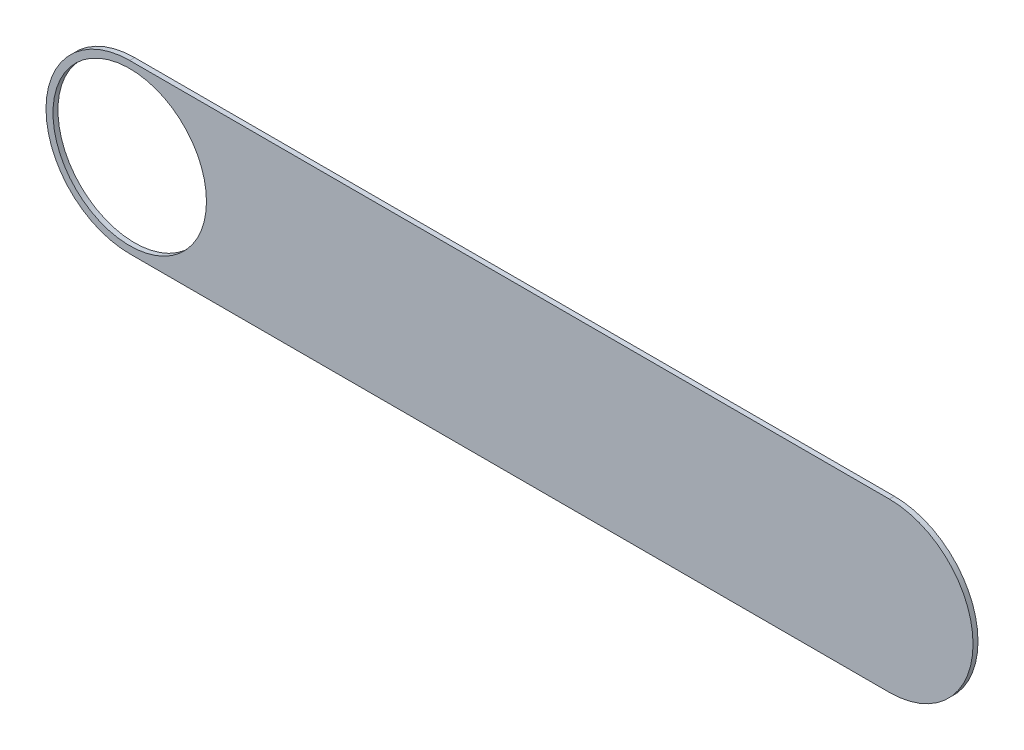
ISO-10303-21;
HEADER;
FILE_DESCRIPTION(('STEP AP214'),'2;1');
FILE_NAME('part.step','',(''),(''),'','','');
FILE_SCHEMA(('AUTOMOTIVE_DESIGN { 1 0 10303 214 1 1 1 1 }'));
ENDSEC;
DATA;
#1=APPLICATION_CONTEXT('core data for automotive mechanical design processes');
#2=APPLICATION_PROTOCOL_DEFINITION('international standard','automotive_design',2000,#1);
#3=PRODUCT_CONTEXT('',#1,'mechanical');
#4=PRODUCT('Part','Part','',(#3));
#5=PRODUCT_RELATED_PRODUCT_CATEGORY('part','',(#4));
#6=PRODUCT_DEFINITION_FORMATION('','',#4);
#7=PRODUCT_DEFINITION_CONTEXT('part definition',#1,'design');
#8=PRODUCT_DEFINITION('design','',#6,#7);
#9=PRODUCT_DEFINITION_SHAPE('','',#8);
#10=(LENGTH_UNIT() NAMED_UNIT(*) SI_UNIT(.MILLI.,.METRE.));
#11=(NAMED_UNIT(*) PLANE_ANGLE_UNIT() SI_UNIT($,.RADIAN.));
#12=(NAMED_UNIT(*) SI_UNIT($,.STERADIAN.) SOLID_ANGLE_UNIT());
#13=UNCERTAINTY_MEASURE_WITH_UNIT(LENGTH_MEASURE(1.E-05),#10,'distance_accuracy_value','');
#14=(GEOMETRIC_REPRESENTATION_CONTEXT(3) GLOBAL_UNCERTAINTY_ASSIGNED_CONTEXT((#13)) GLOBAL_UNIT_ASSIGNED_CONTEXT((#10,
#11,#12)) REPRESENTATION_CONTEXT('',''));
#15=CARTESIAN_POINT('',(0.,0.,0.));
#16=DIRECTION('',(0.,0.,1.));
#17=DIRECTION('',(1.,0.,0.));
#18=AXIS2_PLACEMENT_3D('',#15,#16,#17);
#19=CARTESIAN_POINT('',(85.742018,56.687466,0.));
#20=DIRECTION('',(0.,1.,0.));
#21=DIRECTION('',(1.,0.,0.));
#22=AXIS2_PLACEMENT_3D('',#19,#20,#21);
#23=PLANE('',#22);
#24=DIRECTION('',(1.,0.,0.));
#25=VECTOR('',#24,1.);
#26=CARTESIAN_POINT('',(85.742018,56.687466,0.03556));
#27=LINE('',#26,#25);
#28=CARTESIAN_POINT('',(85.742018,56.687466,0.03556));
#29=VERTEX_POINT('',#28);
#30=CARTESIAN_POINT('',(91.186,56.687466,0.03556));
#31=VERTEX_POINT('',#30);
#32=EDGE_CURVE('E11',#29,#31,#27,.T.);
#33=ORIENTED_EDGE('',*,*,#32,.F.);
#34=DIRECTION('',(0.,0.,1.));
#35=VECTOR('',#34,1.);
#36=CARTESIAN_POINT('',(85.742018,56.687466,0.));
#37=LINE('',#36,#35);
#38=CARTESIAN_POINT('',(85.742018,56.687466,0.));
#39=VERTEX_POINT('',#38);
#40=EDGE_CURVE('E24',#39,#29,#37,.T.);
#41=ORIENTED_EDGE('',*,*,#40,.F.);
#42=DIRECTION('',(1.,0.,0.));
#43=VECTOR('',#42,1.);
#44=CARTESIAN_POINT('',(85.742018,56.687466,0.));
#45=LINE('',#44,#43);
#46=CARTESIAN_POINT('',(91.186,56.687466,0.));
#47=VERTEX_POINT('',#46);
#48=EDGE_CURVE('E96',#39,#47,#45,.T.);
#49=ORIENTED_EDGE('',*,*,#48,.T.);
#50=DIRECTION('',(0.,0.,1.));
#51=VECTOR('',#50,1.);
#52=CARTESIAN_POINT('',(91.186,56.687466,0.));
#53=LINE('',#52,#51);
#54=EDGE_CURVE('E37',#47,#31,#53,.T.);
#55=ORIENTED_EDGE('',*,*,#54,.T.);
#56=EDGE_LOOP('',(#33,#41,#49,#55));
#57=FACE_BOUND('',#56,.T.);
#58=ADVANCED_FACE('F17',(#57),#23,.F.);
#59=CARTESIAN_POINT('',(85.742018,57.2874648,0.));
#60=DIRECTION('',(0.,0.,-1.));
#61=DIRECTION('',(0.,1.,0.));
#62=AXIS2_PLACEMENT_3D('',#59,#60,#61);
#63=CYLINDRICAL_SURFACE('',#62,0.599998799999997);
#64=CARTESIAN_POINT('',(85.742018,57.2874648,0.03556));
#65=DIRECTION('',(0.,0.,1.));
#66=DIRECTION('',(0.,1.,0.));
#67=AXIS2_PLACEMENT_3D('',#64,#65,#66);
#68=CIRCLE('',#67,0.599998799999997);
#69=CARTESIAN_POINT('',(85.742018,57.8874636,0.03556));
#70=VERTEX_POINT('',#69);
#71=EDGE_CURVE('E92',#70,#29,#68,.T.);
#72=ORIENTED_EDGE('',*,*,#71,.F.);
#73=DIRECTION('',(0.,0.,1.));
#74=VECTOR('',#73,1.);
#75=CARTESIAN_POINT('',(85.742018,57.8874636,0.));
#76=LINE('',#75,#74);
#77=CARTESIAN_POINT('',(85.742018,57.8874636,0.));
#78=VERTEX_POINT('',#77);
#79=EDGE_CURVE('E90',#78,#70,#76,.T.);
#80=ORIENTED_EDGE('',*,*,#79,.F.);
#81=CARTESIAN_POINT('',(85.742018,57.2874648,0.));
#82=DIRECTION('',(0.,0.,1.));
#83=DIRECTION('',(0.,1.,0.));
#84=AXIS2_PLACEMENT_3D('',#81,#82,#83);
#85=CIRCLE('',#84,0.599998799999997);
#86=EDGE_CURVE('E88',#78,#39,#85,.T.);
#87=ORIENTED_EDGE('',*,*,#86,.T.);
#88=ORIENTED_EDGE('',*,*,#40,.T.);
#89=EDGE_LOOP('',(#72,#80,#87,#88));
#90=FACE_BOUND('',#89,.T.);
#91=ADVANCED_FACE('F111',(#90),#63,.T.);
#92=CARTESIAN_POINT('',(91.186,57.2874648,0.));
#93=DIRECTION('',(0.,0.,-1.));
#94=DIRECTION('',(0.,-1.,0.));
#95=AXIS2_PLACEMENT_3D('',#92,#93,#94);
#96=CYLINDRICAL_SURFACE('',#95,0.599998800000002);
#97=CARTESIAN_POINT('',(91.186,57.2874648,0.03556));
#98=DIRECTION('',(0.,0.,1.));
#99=DIRECTION('',(0.,-1.,0.));
#100=AXIS2_PLACEMENT_3D('',#97,#98,#99);
#101=CIRCLE('',#100,0.599998800000002);
#102=CARTESIAN_POINT('',(91.186,57.8874636,0.03556));
#103=VERTEX_POINT('',#102);
#104=EDGE_CURVE('E85',#31,#103,#101,.T.);
#105=ORIENTED_EDGE('',*,*,#104,.F.);
#106=ORIENTED_EDGE('',*,*,#54,.F.);
#107=CARTESIAN_POINT('',(91.186,57.2874648,0.));
#108=DIRECTION('',(0.,0.,1.));
#109=DIRECTION('',(0.,-1.,0.));
#110=AXIS2_PLACEMENT_3D('',#107,#108,#109);
#111=CIRCLE('',#110,0.599998800000002);
#112=CARTESIAN_POINT('',(91.186,57.8874636,0.));
#113=VERTEX_POINT('',#112);
#114=EDGE_CURVE('E82',#47,#113,#111,.T.);
#115=ORIENTED_EDGE('',*,*,#114,.T.);
#116=DIRECTION('',(0.,0.,1.));
#117=VECTOR('',#116,1.);
#118=CARTESIAN_POINT('',(91.186,57.8874636,0.));
#119=LINE('',#118,#117);
#120=EDGE_CURVE('E80',#113,#103,#119,.T.);
#121=ORIENTED_EDGE('',*,*,#120,.T.);
#122=EDGE_LOOP('',(#105,#106,#115,#121));
#123=FACE_BOUND('',#122,.T.);
#124=ADVANCED_FACE('F104',(#123),#96,.T.);
#125=CARTESIAN_POINT('',(91.186,57.8874636,0.));
#126=DIRECTION('',(0.,-1.,0.));
#127=DIRECTION('',(-1.,0.,0.));
#128=AXIS2_PLACEMENT_3D('',#125,#126,#127);
#129=PLANE('',#128);
#130=DIRECTION('',(-1.,0.,0.));
#131=VECTOR('',#130,1.);
#132=CARTESIAN_POINT('',(91.186,57.8874636,0.03556));
#133=LINE('',#132,#131);
#134=EDGE_CURVE('E77',#103,#70,#133,.T.);
#135=ORIENTED_EDGE('',*,*,#134,.F.);
#136=ORIENTED_EDGE('',*,*,#120,.F.);
#137=DIRECTION('',(-1.,0.,0.));
#138=VECTOR('',#137,1.);
#139=CARTESIAN_POINT('',(91.186,57.8874636,0.));
#140=LINE('',#139,#138);
#141=EDGE_CURVE('E68',#113,#78,#140,.T.);
#142=ORIENTED_EDGE('',*,*,#141,.T.);
#143=ORIENTED_EDGE('',*,*,#79,.T.);
#144=EDGE_LOOP('',(#135,#136,#142,#143));
#145=FACE_BOUND('',#144,.T.);
#146=ADVANCED_FACE('F110',(#145),#129,.F.);
#147=CARTESIAN_POINT('',(85.742018,57.2874648,0.));
#148=DIRECTION('',(0.,0.,-1.));
#149=DIRECTION('',(1.,0.,0.));
#150=AXIS2_PLACEMENT_3D('',#147,#148,#149);
#151=CYLINDRICAL_SURFACE('',#150,0.5499989);
#152=DIRECTION('',(0.,0.,1.));
#153=VECTOR('',#152,1.);
#154=CARTESIAN_POINT('',(86.2920169,57.2874648,0.));
#155=LINE('',#154,#153);
#156=CARTESIAN_POINT('',(86.2920169,57.2874648,0.));
#157=VERTEX_POINT('',#156);
#158=CARTESIAN_POINT('',(86.2920169,57.2874648,0.03556));
#159=VERTEX_POINT('',#158);
#160=EDGE_CURVE('E62',#157,#159,#155,.T.);
#161=ORIENTED_EDGE('',*,*,#160,.T.);
#162=CARTESIAN_POINT('',(85.742018,57.2874648,0.03556));
#163=DIRECTION('',(0.,0.,1.));
#164=DIRECTION('',(1.,0.,0.));
#165=AXIS2_PLACEMENT_3D('',#162,#163,#164);
#166=CIRCLE('',#165,0.5499989);
#167=EDGE_CURVE('E67',#159,#159,#166,.T.);
#168=ORIENTED_EDGE('',*,*,#167,.T.);
#169=ORIENTED_EDGE('',*,*,#160,.F.);
#170=CARTESIAN_POINT('',(85.742018,57.2874648,0.));
#171=DIRECTION('',(0.,0.,1.));
#172=DIRECTION('',(1.,0.,0.));
#173=AXIS2_PLACEMENT_3D('',#170,#171,#172);
#174=CIRCLE('',#173,0.5499989);
#175=EDGE_CURVE('E65',#157,#157,#174,.T.);
#176=ORIENTED_EDGE('',*,*,#175,.F.);
#177=EDGE_LOOP('',(#161,#168,#169,#176));
#178=FACE_BOUND('',#177,.T.);
#179=ADVANCED_FACE('F64',(#178),#151,.F.);
#180=CARTESIAN_POINT('',(85.742018,56.687466,0.));
#181=DIRECTION('',(0.,0.,-1.));
#182=DIRECTION('',(-1.,0.,0.));
#183=AXIS2_PLACEMENT_3D('',#180,#181,#182);
#184=PLANE('',#183);
#185=ORIENTED_EDGE('',*,*,#48,.F.);
#186=ORIENTED_EDGE('',*,*,#86,.F.);
#187=ORIENTED_EDGE('',*,*,#141,.F.);
#188=ORIENTED_EDGE('',*,*,#114,.F.);
#189=EDGE_LOOP('',(#185,#186,#187,#188));
#190=FACE_BOUND('',#189,.T.);
#191=ORIENTED_EDGE('',*,*,#175,.T.);
#192=EDGE_LOOP('',(#191));
#193=FACE_BOUND('',#192,.T.);
#194=ADVANCED_FACE('F71',(#190,#193),#184,.T.);
#195=CARTESIAN_POINT('',(85.742018,56.687466,0.03556));
#196=DIRECTION('',(0.,0.,-1.));
#197=DIRECTION('',(-1.,0.,0.));
#198=AXIS2_PLACEMENT_3D('',#195,#196,#197);
#199=PLANE('',#198);
#200=ORIENTED_EDGE('',*,*,#134,.T.);
#201=ORIENTED_EDGE('',*,*,#71,.T.);
#202=ORIENTED_EDGE('',*,*,#32,.T.);
#203=ORIENTED_EDGE('',*,*,#104,.T.);
#204=EDGE_LOOP('',(#200,#201,#202,#203));
#205=FACE_BOUND('',#204,.T.);
#206=ORIENTED_EDGE('',*,*,#167,.F.);
#207=EDGE_LOOP('',(#206));
#208=FACE_BOUND('',#207,.T.);
#209=ADVANCED_FACE('F107',(#205,#208),#199,.F.);
#210=CLOSED_SHELL('',(#58,#91,#124,#146,#179,#194,#209));
#211=MANIFOLD_SOLID_BREP('B1',#210);
#212=ADVANCED_BREP_SHAPE_REPRESENTATION('',(#18,#211),#14);
#213=SHAPE_DEFINITION_REPRESENTATION(#9,#212);
ENDSEC;
END-ISO-10303-21;
